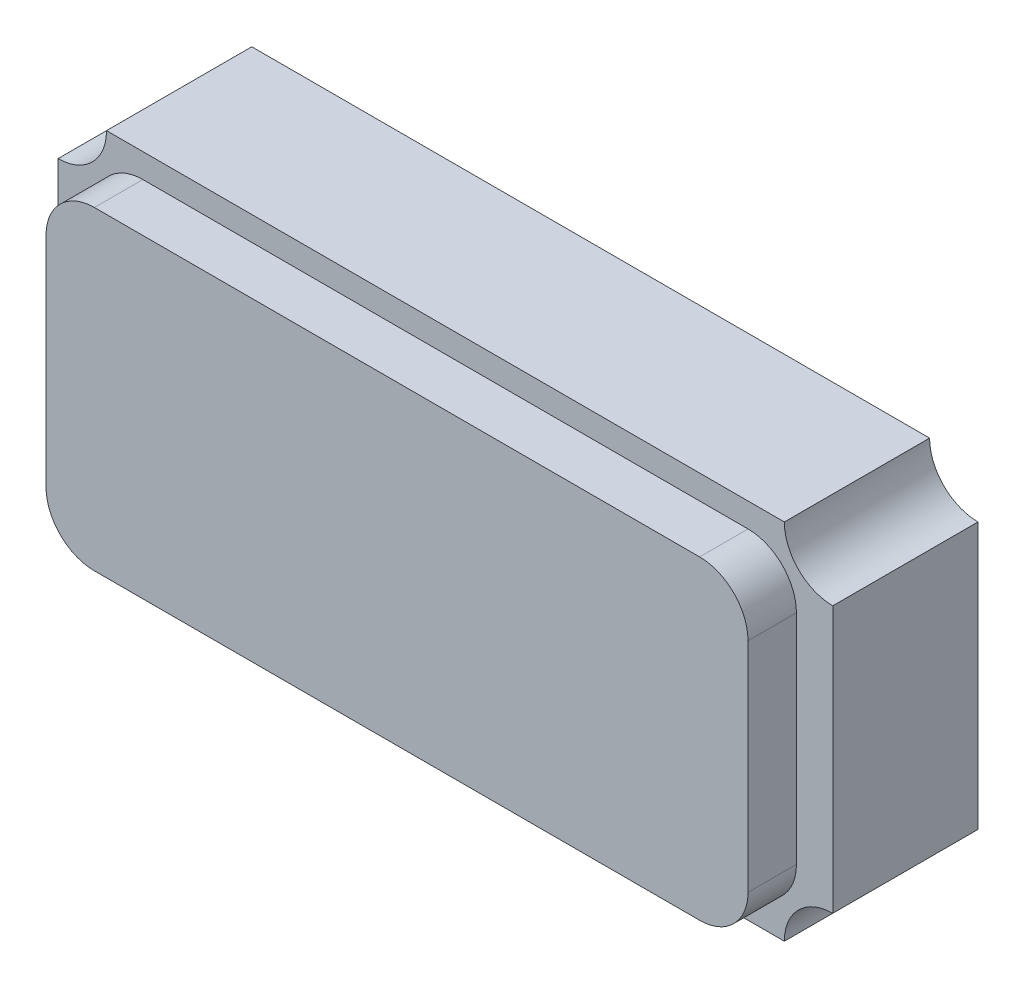
ISO-10303-21;
HEADER;
FILE_DESCRIPTION(('STEP AP214'),'2;1');
FILE_NAME('part.step','',(''),(''),'','','');
FILE_SCHEMA(('AUTOMOTIVE_DESIGN { 1 0 10303 214 1 1 1 1 }'));
ENDSEC;
DATA;
#1=APPLICATION_CONTEXT('core data for automotive mechanical design processes');
#2=APPLICATION_PROTOCOL_DEFINITION('international standard','automotive_design',2000,#1);
#3=PRODUCT_CONTEXT('',#1,'mechanical');
#4=PRODUCT('Part','Part','',(#3));
#5=PRODUCT_RELATED_PRODUCT_CATEGORY('part','',(#4));
#6=PRODUCT_DEFINITION_FORMATION('','',#4);
#7=PRODUCT_DEFINITION_CONTEXT('part definition',#1,'design');
#8=PRODUCT_DEFINITION('design','',#6,#7);
#9=PRODUCT_DEFINITION_SHAPE('','',#8);
#10=(LENGTH_UNIT() NAMED_UNIT(*) SI_UNIT(.MILLI.,.METRE.));
#11=(NAMED_UNIT(*) PLANE_ANGLE_UNIT() SI_UNIT($,.RADIAN.));
#12=(NAMED_UNIT(*) SI_UNIT($,.STERADIAN.) SOLID_ANGLE_UNIT());
#13=UNCERTAINTY_MEASURE_WITH_UNIT(LENGTH_MEASURE(1.E-05),#10,'distance_accuracy_value','');
#14=(GEOMETRIC_REPRESENTATION_CONTEXT(3) GLOBAL_UNCERTAINTY_ASSIGNED_CONTEXT((#13)) GLOBAL_UNIT_ASSIGNED_CONTEXT((#10,
#11,#12)) REPRESENTATION_CONTEXT('',''));
#15=CARTESIAN_POINT('',(0.,0.,0.));
#16=DIRECTION('',(0.,0.,1.));
#17=DIRECTION('',(1.,0.,0.));
#18=AXIS2_PLACEMENT_3D('',#15,#16,#17);
#19=CARTESIAN_POINT('',(-1.6,0.75,0.6));
#20=DIRECTION('',(0.,0.,1.));
#21=DIRECTION('',(1.,0.,0.));
#22=AXIS2_PLACEMENT_3D('',#19,#20,#21);
#23=PLANE('',#22);
#24=CARTESIAN_POINT('',(-1.6,0.75,0.6));
#25=DIRECTION('',(0.,0.,-1.));
#26=DIRECTION('',(1.,0.,0.));
#27=AXIS2_PLACEMENT_3D('',#24,#25,#26);
#28=CIRCLE('',#27,0.2);
#29=CARTESIAN_POINT('',(-1.4,0.75,0.6));
#30=VERTEX_POINT('',#29);
#31=CARTESIAN_POINT('',(-1.6,0.55,0.6));
#32=VERTEX_POINT('',#31);
#33=EDGE_CURVE('E160',#30,#32,#28,.T.);
#34=ORIENTED_EDGE('',*,*,#33,.T.);
#35=DIRECTION('',(0.,-1.,0.));
#36=VECTOR('',#35,1.);
#37=CARTESIAN_POINT('',(-1.6,-0.55,0.6));
#38=LINE('',#37,#36);
#39=CARTESIAN_POINT('',(-1.6,-0.55,0.6));
#40=VERTEX_POINT('',#39);
#41=EDGE_CURVE('E100',#32,#40,#38,.T.);
#42=ORIENTED_EDGE('',*,*,#41,.T.);
#43=CARTESIAN_POINT('',(-1.6,-0.75,0.6));
#44=DIRECTION('',(0.,0.,-1.));
#45=DIRECTION('',(-1.,0.,0.));
#46=AXIS2_PLACEMENT_3D('',#43,#44,#45);
#47=CIRCLE('',#46,0.2);
#48=CARTESIAN_POINT('',(-1.4,-0.75,0.6));
#49=VERTEX_POINT('',#48);
#50=EDGE_CURVE('E175',#40,#49,#47,.T.);
#51=ORIENTED_EDGE('',*,*,#50,.T.);
#52=DIRECTION('',(1.,0.,0.));
#53=VECTOR('',#52,1.);
#54=CARTESIAN_POINT('',(1.4,-0.75,0.6));
#55=LINE('',#54,#53);
#56=CARTESIAN_POINT('',(1.4,-0.75,0.6));
#57=VERTEX_POINT('',#56);
#58=EDGE_CURVE('E187',#49,#57,#55,.T.);
#59=ORIENTED_EDGE('',*,*,#58,.T.);
#60=CARTESIAN_POINT('',(1.6,-0.75,0.6));
#61=DIRECTION('',(0.,0.,-1.));
#62=DIRECTION('',(1.,0.,0.));
#63=AXIS2_PLACEMENT_3D('',#60,#61,#62);
#64=CIRCLE('',#63,0.2);
#65=CARTESIAN_POINT('',(1.6,-0.55,0.6));
#66=VERTEX_POINT('',#65);
#67=EDGE_CURVE('E123',#57,#66,#64,.T.);
#68=ORIENTED_EDGE('',*,*,#67,.T.);
#69=DIRECTION('',(0.,1.,0.));
#70=VECTOR('',#69,1.);
#71=CARTESIAN_POINT('',(1.6,-0.55,0.6));
#72=LINE('',#71,#70);
#73=CARTESIAN_POINT('',(1.6,0.55,0.6));
#74=VERTEX_POINT('',#73);
#75=EDGE_CURVE('E116',#66,#74,#72,.T.);
#76=ORIENTED_EDGE('',*,*,#75,.T.);
#77=CARTESIAN_POINT('',(1.6,0.75,0.6));
#78=DIRECTION('',(0.,0.,-1.));
#79=DIRECTION('',(-1.,0.,0.));
#80=AXIS2_PLACEMENT_3D('',#77,#78,#79);
#81=CIRCLE('',#80,0.2);
#82=CARTESIAN_POINT('',(1.4,0.75,0.6));
#83=VERTEX_POINT('',#82);
#84=EDGE_CURVE('E120',#74,#83,#81,.T.);
#85=ORIENTED_EDGE('',*,*,#84,.T.);
#86=DIRECTION('',(-1.,0.,0.));
#87=VECTOR('',#86,1.);
#88=CARTESIAN_POINT('',(1.4,0.75,0.6));
#89=LINE('',#88,#87);
#90=EDGE_CURVE('E59',#83,#30,#89,.T.);
#91=ORIENTED_EDGE('',*,*,#90,.T.);
#92=EDGE_LOOP('',(#34,#42,#51,#59,#68,#76,#85,#91));
#93=FACE_BOUND('',#92,.T.);
#94=DIRECTION('',(-1.,0.,0.));
#95=VECTOR('',#94,1.);
#96=CARTESIAN_POINT('',(-1.25,0.65,0.6));
#97=LINE('',#96,#95);
#98=CARTESIAN_POINT('',(1.25,0.65,0.6));
#99=VERTEX_POINT('',#98);
#100=CARTESIAN_POINT('',(-1.25,0.65,0.6));
#101=VERTEX_POINT('',#100);
#102=EDGE_CURVE('E232',#99,#101,#97,.T.);
#103=ORIENTED_EDGE('',*,*,#102,.F.);
#104=CARTESIAN_POINT('',(1.25,0.45,0.6));
#105=DIRECTION('',(0.,0.,1.));
#106=DIRECTION('',(-1.,0.,0.));
#107=AXIS2_PLACEMENT_3D('',#104,#105,#106);
#108=CIRCLE('',#107,0.2);
#109=CARTESIAN_POINT('',(1.45,0.45,0.6));
#110=VERTEX_POINT('',#109);
#111=EDGE_CURVE('E235',#110,#99,#108,.T.);
#112=ORIENTED_EDGE('',*,*,#111,.F.);
#113=DIRECTION('',(0.,1.,0.));
#114=VECTOR('',#113,1.);
#115=CARTESIAN_POINT('',(1.45,0.45,0.6));
#116=LINE('',#115,#114);
#117=CARTESIAN_POINT('',(1.45,-0.45,0.6));
#118=VERTEX_POINT('',#117);
#119=EDGE_CURVE('E215',#118,#110,#116,.T.);
#120=ORIENTED_EDGE('',*,*,#119,.F.);
#121=CARTESIAN_POINT('',(1.25,-0.45,0.6));
#122=DIRECTION('',(0.,0.,1.));
#123=DIRECTION('',(1.,0.,0.));
#124=AXIS2_PLACEMENT_3D('',#121,#122,#123);
#125=CIRCLE('',#124,0.2);
#126=CARTESIAN_POINT('',(1.25,-0.65,0.6));
#127=VERTEX_POINT('',#126);
#128=EDGE_CURVE('E218',#127,#118,#125,.T.);
#129=ORIENTED_EDGE('',*,*,#128,.F.);
#130=DIRECTION('',(1.,0.,0.));
#131=VECTOR('',#130,1.);
#132=CARTESIAN_POINT('',(-1.25,-0.65,0.6));
#133=LINE('',#132,#131);
#134=CARTESIAN_POINT('',(-1.25,-0.65,0.6));
#135=VERTEX_POINT('',#134);
#136=EDGE_CURVE('E220',#135,#127,#133,.T.);
#137=ORIENTED_EDGE('',*,*,#136,.F.);
#138=CARTESIAN_POINT('',(-1.25,-0.45,0.6));
#139=DIRECTION('',(0.,0.,1.));
#140=DIRECTION('',(-1.,0.,0.));
#141=AXIS2_PLACEMENT_3D('',#138,#139,#140);
#142=CIRCLE('',#141,0.2);
#143=CARTESIAN_POINT('',(-1.45,-0.45,0.6));
#144=VERTEX_POINT('',#143);
#145=EDGE_CURVE('E223',#144,#135,#142,.T.);
#146=ORIENTED_EDGE('',*,*,#145,.F.);
#147=DIRECTION('',(0.,-1.,0.));
#148=VECTOR('',#147,1.);
#149=CARTESIAN_POINT('',(-1.45,0.45,0.6));
#150=LINE('',#149,#148);
#151=CARTESIAN_POINT('',(-1.45,0.45,0.6));
#152=VERTEX_POINT('',#151);
#153=EDGE_CURVE('E226',#152,#144,#150,.T.);
#154=ORIENTED_EDGE('',*,*,#153,.F.);
#155=CARTESIAN_POINT('',(-1.25,0.45,0.6));
#156=DIRECTION('',(0.,0.,1.));
#157=DIRECTION('',(1.,0.,0.));
#158=AXIS2_PLACEMENT_3D('',#155,#156,#157);
#159=CIRCLE('',#158,0.2);
#160=EDGE_CURVE('E229',#101,#152,#159,.T.);
#161=ORIENTED_EDGE('',*,*,#160,.F.);
#162=EDGE_LOOP('',(#103,#112,#120,#129,#137,#146,#154,#161));
#163=FACE_BOUND('',#162,.T.);
#164=ADVANCED_FACE('F35',(#93,#163),#23,.T.);
#165=CARTESIAN_POINT('',(-1.6,0.75,0.6));
#166=DIRECTION('',(0.,0.,-1.));
#167=DIRECTION('',(-1.,0.,0.));
#168=AXIS2_PLACEMENT_3D('',#165,#166,#167);
#169=CYLINDRICAL_SURFACE('',#168,0.2);
#170=CARTESIAN_POINT('',(-1.6,0.75,0.));
#171=DIRECTION('',(0.,0.,-1.));
#172=DIRECTION('',(1.,0.,0.));
#173=AXIS2_PLACEMENT_3D('',#170,#171,#172);
#174=CIRCLE('',#173,0.2);
#175=CARTESIAN_POINT('',(-1.4,0.75,0.));
#176=VERTEX_POINT('',#175);
#177=CARTESIAN_POINT('',(-1.6,0.55,0.));
#178=VERTEX_POINT('',#177);
#179=EDGE_CURVE('E144',#176,#178,#174,.T.);
#180=ORIENTED_EDGE('',*,*,#179,.T.);
#181=DIRECTION('',(0.,0.,-1.));
#182=VECTOR('',#181,1.);
#183=CARTESIAN_POINT('',(-1.6,0.55,0.6));
#184=LINE('',#183,#182);
#185=EDGE_CURVE('E11',#32,#178,#184,.T.);
#186=ORIENTED_EDGE('',*,*,#185,.F.);
#187=ORIENTED_EDGE('',*,*,#33,.F.);
#188=DIRECTION('',(0.,0.,-1.));
#189=VECTOR('',#188,1.);
#190=CARTESIAN_POINT('',(-1.4,0.75,0.6));
#191=LINE('',#190,#189);
#192=EDGE_CURVE('E140',#30,#176,#191,.T.);
#193=ORIENTED_EDGE('',*,*,#192,.T.);
#194=EDGE_LOOP('',(#180,#186,#187,#193));
#195=FACE_BOUND('',#194,.T.);
#196=ADVANCED_FACE('F37',(#195),#169,.F.);
#197=CARTESIAN_POINT('',(-1.6,-0.55,0.6));
#198=DIRECTION('',(1.,0.,0.));
#199=DIRECTION('',(0.,1.,0.));
#200=AXIS2_PLACEMENT_3D('',#197,#198,#199);
#201=PLANE('',#200);
#202=DIRECTION('',(0.,-1.,0.));
#203=VECTOR('',#202,1.);
#204=CARTESIAN_POINT('',(-1.6,-0.55,0.));
#205=LINE('',#204,#203);
#206=CARTESIAN_POINT('',(-1.6,-0.55,0.));
#207=VERTEX_POINT('',#206);
#208=EDGE_CURVE('E147',#178,#207,#205,.T.);
#209=ORIENTED_EDGE('',*,*,#208,.T.);
#210=DIRECTION('',(0.,0.,-1.));
#211=VECTOR('',#210,1.);
#212=CARTESIAN_POINT('',(-1.6,-0.55,0.6));
#213=LINE('',#212,#211);
#214=EDGE_CURVE('E43',#40,#207,#213,.T.);
#215=ORIENTED_EDGE('',*,*,#214,.F.);
#216=ORIENTED_EDGE('',*,*,#41,.F.);
#217=ORIENTED_EDGE('',*,*,#185,.T.);
#218=EDGE_LOOP('',(#209,#215,#216,#217));
#219=FACE_BOUND('',#218,.T.);
#220=ADVANCED_FACE('F337',(#219),#201,.F.);
#221=CARTESIAN_POINT('',(-1.6,-0.75,0.6));
#222=DIRECTION('',(0.,0.,-1.));
#223=DIRECTION('',(-1.,0.,0.));
#224=AXIS2_PLACEMENT_3D('',#221,#222,#223);
#225=CYLINDRICAL_SURFACE('',#224,0.2);
#226=CARTESIAN_POINT('',(-1.6,-0.75,0.));
#227=DIRECTION('',(0.,0.,-1.));
#228=DIRECTION('',(-1.,0.,0.));
#229=AXIS2_PLACEMENT_3D('',#226,#227,#228);
#230=CIRCLE('',#229,0.2);
#231=CARTESIAN_POINT('',(-1.4,-0.75,0.));
#232=VERTEX_POINT('',#231);
#233=EDGE_CURVE('E150',#207,#232,#230,.T.);
#234=ORIENTED_EDGE('',*,*,#233,.T.);
#235=DIRECTION('',(0.,0.,-1.));
#236=VECTOR('',#235,1.);
#237=CARTESIAN_POINT('',(-1.4,-0.75,0.6));
#238=LINE('',#237,#236);
#239=EDGE_CURVE('E167',#49,#232,#238,.T.);
#240=ORIENTED_EDGE('',*,*,#239,.F.);
#241=ORIENTED_EDGE('',*,*,#50,.F.);
#242=ORIENTED_EDGE('',*,*,#214,.T.);
#243=EDGE_LOOP('',(#234,#240,#241,#242));
#244=FACE_BOUND('',#243,.T.);
#245=ADVANCED_FACE('F173',(#244),#225,.F.);
#246=CARTESIAN_POINT('',(1.4,-0.75,0.6));
#247=DIRECTION('',(0.,1.,0.));
#248=DIRECTION('',(-1.,0.,0.));
#249=AXIS2_PLACEMENT_3D('',#246,#247,#248);
#250=PLANE('',#249);
#251=DIRECTION('',(1.,0.,0.));
#252=VECTOR('',#251,1.);
#253=CARTESIAN_POINT('',(1.4,-0.75,0.));
#254=LINE('',#253,#252);
#255=CARTESIAN_POINT('',(1.4,-0.75,0.));
#256=VERTEX_POINT('',#255);
#257=EDGE_CURVE('E152',#232,#256,#254,.T.);
#258=ORIENTED_EDGE('',*,*,#257,.T.);
#259=DIRECTION('',(0.,0.,-1.));
#260=VECTOR('',#259,1.);
#261=CARTESIAN_POINT('',(1.4,-0.75,0.6));
#262=LINE('',#261,#260);
#263=EDGE_CURVE('E164',#57,#256,#262,.T.);
#264=ORIENTED_EDGE('',*,*,#263,.F.);
#265=ORIENTED_EDGE('',*,*,#58,.F.);
#266=ORIENTED_EDGE('',*,*,#239,.T.);
#267=EDGE_LOOP('',(#258,#264,#265,#266));
#268=FACE_BOUND('',#267,.T.);
#269=ADVANCED_FACE('F183',(#268),#250,.F.);
#270=CARTESIAN_POINT('',(1.6,-0.75,0.6));
#271=DIRECTION('',(0.,0.,-1.));
#272=DIRECTION('',(-1.,0.,0.));
#273=AXIS2_PLACEMENT_3D('',#270,#271,#272);
#274=CYLINDRICAL_SURFACE('',#273,0.2);
#275=CARTESIAN_POINT('',(1.6,-0.75,0.));
#276=DIRECTION('',(0.,0.,-1.));
#277=DIRECTION('',(1.,0.,0.));
#278=AXIS2_PLACEMENT_3D('',#275,#276,#277);
#279=CIRCLE('',#278,0.2);
#280=CARTESIAN_POINT('',(1.6,-0.55,0.));
#281=VERTEX_POINT('',#280);
#282=EDGE_CURVE('E154',#256,#281,#279,.T.);
#283=ORIENTED_EDGE('',*,*,#282,.T.);
#284=DIRECTION('',(0.,0.,-1.));
#285=VECTOR('',#284,1.);
#286=CARTESIAN_POINT('',(1.6,-0.55,0.6));
#287=LINE('',#286,#285);
#288=EDGE_CURVE('E135',#66,#281,#287,.T.);
#289=ORIENTED_EDGE('',*,*,#288,.F.);
#290=ORIENTED_EDGE('',*,*,#67,.F.);
#291=ORIENTED_EDGE('',*,*,#263,.T.);
#292=EDGE_LOOP('',(#283,#289,#290,#291));
#293=FACE_BOUND('',#292,.T.);
#294=ADVANCED_FACE('F186',(#293),#274,.F.);
#295=CARTESIAN_POINT('',(1.6,-0.55,0.6));
#296=DIRECTION('',(-1.,0.,0.));
#297=DIRECTION('',(0.,-1.,0.));
#298=AXIS2_PLACEMENT_3D('',#295,#296,#297);
#299=PLANE('',#298);
#300=DIRECTION('',(0.,1.,0.));
#301=VECTOR('',#300,1.);
#302=CARTESIAN_POINT('',(1.6,-0.55,0.));
#303=LINE('',#302,#301);
#304=CARTESIAN_POINT('',(1.6,0.55,0.));
#305=VERTEX_POINT('',#304);
#306=EDGE_CURVE('E132',#281,#305,#303,.T.);
#307=ORIENTED_EDGE('',*,*,#306,.T.);
#308=DIRECTION('',(0.,0.,-1.));
#309=VECTOR('',#308,1.);
#310=CARTESIAN_POINT('',(1.6,0.55,0.6));
#311=LINE('',#310,#309);
#312=EDGE_CURVE('E129',#74,#305,#311,.T.);
#313=ORIENTED_EDGE('',*,*,#312,.F.);
#314=ORIENTED_EDGE('',*,*,#75,.F.);
#315=ORIENTED_EDGE('',*,*,#288,.T.);
#316=EDGE_LOOP('',(#307,#313,#314,#315));
#317=FACE_BOUND('',#316,.T.);
#318=ADVANCED_FACE('F130',(#317),#299,.F.);
#319=CARTESIAN_POINT('',(1.6,0.75,0.6));
#320=DIRECTION('',(0.,0.,-1.));
#321=DIRECTION('',(-1.,0.,0.));
#322=AXIS2_PLACEMENT_3D('',#319,#320,#321);
#323=CYLINDRICAL_SURFACE('',#322,0.2);
#324=CARTESIAN_POINT('',(1.6,0.75,0.));
#325=DIRECTION('',(0.,0.,-1.));
#326=DIRECTION('',(-1.,0.,0.));
#327=AXIS2_PLACEMENT_3D('',#324,#325,#326);
#328=CIRCLE('',#327,0.2);
#329=CARTESIAN_POINT('',(1.4,0.75,0.));
#330=VERTEX_POINT('',#329);
#331=EDGE_CURVE('E157',#305,#330,#328,.T.);
#332=ORIENTED_EDGE('',*,*,#331,.T.);
#333=DIRECTION('',(0.,0.,-1.));
#334=VECTOR('',#333,1.);
#335=CARTESIAN_POINT('',(1.4,0.75,0.6));
#336=LINE('',#335,#334);
#337=EDGE_CURVE('E136',#83,#330,#336,.T.);
#338=ORIENTED_EDGE('',*,*,#337,.F.);
#339=ORIENTED_EDGE('',*,*,#84,.F.);
#340=ORIENTED_EDGE('',*,*,#312,.T.);
#341=EDGE_LOOP('',(#332,#338,#339,#340));
#342=FACE_BOUND('',#341,.T.);
#343=ADVANCED_FACE('F138',(#342),#323,.F.);
#344=CARTESIAN_POINT('',(1.4,0.75,0.6));
#345=DIRECTION('',(0.,-1.,0.));
#346=DIRECTION('',(1.,0.,0.));
#347=AXIS2_PLACEMENT_3D('',#344,#345,#346);
#348=PLANE('',#347);
#349=DIRECTION('',(-1.,0.,0.));
#350=VECTOR('',#349,1.);
#351=CARTESIAN_POINT('',(1.4,0.75,0.));
#352=LINE('',#351,#350);
#353=EDGE_CURVE('E92',#330,#176,#352,.T.);
#354=ORIENTED_EDGE('',*,*,#353,.T.);
#355=ORIENTED_EDGE('',*,*,#192,.F.);
#356=ORIENTED_EDGE('',*,*,#90,.F.);
#357=ORIENTED_EDGE('',*,*,#337,.T.);
#358=EDGE_LOOP('',(#354,#355,#356,#357));
#359=FACE_BOUND('',#358,.T.);
#360=ADVANCED_FACE('F344',(#359),#348,.F.);
#361=CARTESIAN_POINT('',(-1.6,0.75,0.));
#362=DIRECTION('',(0.,0.,1.));
#363=DIRECTION('',(1.,0.,0.));
#364=AXIS2_PLACEMENT_3D('',#361,#362,#363);
#365=PLANE('',#364);
#366=ORIENTED_EDGE('',*,*,#179,.F.);
#367=ORIENTED_EDGE('',*,*,#353,.F.);
#368=ORIENTED_EDGE('',*,*,#331,.F.);
#369=ORIENTED_EDGE('',*,*,#306,.F.);
#370=ORIENTED_EDGE('',*,*,#282,.F.);
#371=ORIENTED_EDGE('',*,*,#257,.F.);
#372=ORIENTED_EDGE('',*,*,#233,.F.);
#373=ORIENTED_EDGE('',*,*,#208,.F.);
#374=EDGE_LOOP('',(#366,#367,#368,#369,#370,#371,#372,#373));
#375=FACE_BOUND('',#374,.T.);
#376=ADVANCED_FACE('F179',(#375),#365,.F.);
#377=CARTESIAN_POINT('',(1.25,0.45,0.8));
#378=DIRECTION('',(0.,0.,-1.));
#379=DIRECTION('',(-1.,0.,0.));
#380=AXIS2_PLACEMENT_3D('',#377,#378,#379);
#381=CYLINDRICAL_SURFACE('',#380,0.2);
#382=ORIENTED_EDGE('',*,*,#111,.T.);
#383=DIRECTION('',(0.,0.,-1.));
#384=VECTOR('',#383,1.);
#385=CARTESIAN_POINT('',(1.25,0.65,0.8));
#386=LINE('',#385,#384);
#387=CARTESIAN_POINT('',(1.25,0.65,0.8));
#388=VERTEX_POINT('',#387);
#389=EDGE_CURVE('E148',#388,#99,#386,.T.);
#390=ORIENTED_EDGE('',*,*,#389,.F.);
#391=CARTESIAN_POINT('',(1.25,0.45,0.8));
#392=DIRECTION('',(0.,0.,1.));
#393=DIRECTION('',(-1.,0.,0.));
#394=AXIS2_PLACEMENT_3D('',#391,#392,#393);
#395=CIRCLE('',#394,0.2);
#396=CARTESIAN_POINT('',(1.45,0.45,0.8));
#397=VERTEX_POINT('',#396);
#398=EDGE_CURVE('E217',#397,#388,#395,.T.);
#399=ORIENTED_EDGE('',*,*,#398,.F.);
#400=DIRECTION('',(0.,0.,-1.));
#401=VECTOR('',#400,1.);
#402=CARTESIAN_POINT('',(1.45,0.45,0.8));
#403=LINE('',#402,#401);
#404=EDGE_CURVE('E211',#397,#110,#403,.T.);
#405=ORIENTED_EDGE('',*,*,#404,.T.);
#406=EDGE_LOOP('',(#382,#390,#399,#405));
#407=FACE_BOUND('',#406,.T.);
#408=ADVANCED_FACE('F270',(#407),#381,.T.);
#409=CARTESIAN_POINT('',(-1.25,0.65,0.8));
#410=DIRECTION('',(0.,-1.,0.));
#411=DIRECTION('',(1.,0.,0.));
#412=AXIS2_PLACEMENT_3D('',#409,#410,#411);
#413=PLANE('',#412);
#414=ORIENTED_EDGE('',*,*,#102,.T.);
#415=DIRECTION('',(0.,0.,-1.));
#416=VECTOR('',#415,1.);
#417=CARTESIAN_POINT('',(-1.25,0.65,0.8));
#418=LINE('',#417,#416);
#419=CARTESIAN_POINT('',(-1.25,0.65,0.8));
#420=VERTEX_POINT('',#419);
#421=EDGE_CURVE('E195',#420,#101,#418,.T.);
#422=ORIENTED_EDGE('',*,*,#421,.F.);
#423=DIRECTION('',(-1.,0.,0.));
#424=VECTOR('',#423,1.);
#425=CARTESIAN_POINT('',(-1.25,0.65,0.8));
#426=LINE('',#425,#424);
#427=EDGE_CURVE('E255',#388,#420,#426,.T.);
#428=ORIENTED_EDGE('',*,*,#427,.F.);
#429=ORIENTED_EDGE('',*,*,#389,.T.);
#430=EDGE_LOOP('',(#414,#422,#428,#429));
#431=FACE_BOUND('',#430,.T.);
#432=ADVANCED_FACE('F275',(#431),#413,.F.);
#433=CARTESIAN_POINT('',(-1.25,0.45,0.8));
#434=DIRECTION('',(0.,0.,-1.));
#435=DIRECTION('',(-1.,0.,0.));
#436=AXIS2_PLACEMENT_3D('',#433,#434,#435);
#437=CYLINDRICAL_SURFACE('',#436,0.2);
#438=ORIENTED_EDGE('',*,*,#160,.T.);
#439=DIRECTION('',(0.,0.,-1.));
#440=VECTOR('',#439,1.);
#441=CARTESIAN_POINT('',(-1.45,0.45,0.8));
#442=LINE('',#441,#440);
#443=CARTESIAN_POINT('',(-1.45,0.45,0.8));
#444=VERTEX_POINT('',#443);
#445=EDGE_CURVE('E198',#444,#152,#442,.T.);
#446=ORIENTED_EDGE('',*,*,#445,.F.);
#447=CARTESIAN_POINT('',(-1.25,0.45,0.8));
#448=DIRECTION('',(0.,0.,1.));
#449=DIRECTION('',(1.,0.,0.));
#450=AXIS2_PLACEMENT_3D('',#447,#448,#449);
#451=CIRCLE('',#450,0.2);
#452=EDGE_CURVE('E252',#420,#444,#451,.T.);
#453=ORIENTED_EDGE('',*,*,#452,.F.);
#454=ORIENTED_EDGE('',*,*,#421,.T.);
#455=EDGE_LOOP('',(#438,#446,#453,#454));
#456=FACE_BOUND('',#455,.T.);
#457=ADVANCED_FACE('F299',(#456),#437,.T.);
#458=CARTESIAN_POINT('',(-1.45,0.45,0.8));
#459=DIRECTION('',(1.,0.,0.));
#460=DIRECTION('',(0.,0.,-1.));
#461=AXIS2_PLACEMENT_3D('',#458,#459,#460);
#462=PLANE('',#461);
#463=ORIENTED_EDGE('',*,*,#153,.T.);
#464=DIRECTION('',(0.,0.,-1.));
#465=VECTOR('',#464,1.);
#466=CARTESIAN_POINT('',(-1.45,-0.45,0.8));
#467=LINE('',#466,#465);
#468=CARTESIAN_POINT('',(-1.45,-0.45,0.8));
#469=VERTEX_POINT('',#468);
#470=EDGE_CURVE('E201',#469,#144,#467,.T.);
#471=ORIENTED_EDGE('',*,*,#470,.F.);
#472=DIRECTION('',(0.,-1.,0.));
#473=VECTOR('',#472,1.);
#474=CARTESIAN_POINT('',(-1.45,0.45,0.8));
#475=LINE('',#474,#473);
#476=EDGE_CURVE('E249',#444,#469,#475,.T.);
#477=ORIENTED_EDGE('',*,*,#476,.F.);
#478=ORIENTED_EDGE('',*,*,#445,.T.);
#479=EDGE_LOOP('',(#463,#471,#477,#478));
#480=FACE_BOUND('',#479,.T.);
#481=ADVANCED_FACE('F304',(#480),#462,.F.);
#482=CARTESIAN_POINT('',(-1.25,-0.45,0.8));
#483=DIRECTION('',(0.,0.,-1.));
#484=DIRECTION('',(-1.,0.,0.));
#485=AXIS2_PLACEMENT_3D('',#482,#483,#484);
#486=CYLINDRICAL_SURFACE('',#485,0.2);
#487=ORIENTED_EDGE('',*,*,#145,.T.);
#488=DIRECTION('',(0.,0.,-1.));
#489=VECTOR('',#488,1.);
#490=CARTESIAN_POINT('',(-1.25,-0.65,0.8));
#491=LINE('',#490,#489);
#492=CARTESIAN_POINT('',(-1.25,-0.65,0.8));
#493=VERTEX_POINT('',#492);
#494=EDGE_CURVE('E204',#493,#135,#491,.T.);
#495=ORIENTED_EDGE('',*,*,#494,.F.);
#496=CARTESIAN_POINT('',(-1.25,-0.45,0.8));
#497=DIRECTION('',(0.,0.,1.));
#498=DIRECTION('',(-1.,0.,0.));
#499=AXIS2_PLACEMENT_3D('',#496,#497,#498);
#500=CIRCLE('',#499,0.2);
#501=EDGE_CURVE('E246',#469,#493,#500,.T.);
#502=ORIENTED_EDGE('',*,*,#501,.F.);
#503=ORIENTED_EDGE('',*,*,#470,.T.);
#504=EDGE_LOOP('',(#487,#495,#502,#503));
#505=FACE_BOUND('',#504,.T.);
#506=ADVANCED_FACE('F322',(#505),#486,.T.);
#507=CARTESIAN_POINT('',(-1.25,-0.65,0.8));
#508=DIRECTION('',(0.,1.,0.));
#509=DIRECTION('',(-1.,0.,0.));
#510=AXIS2_PLACEMENT_3D('',#507,#508,#509);
#511=PLANE('',#510);
#512=ORIENTED_EDGE('',*,*,#136,.T.);
#513=DIRECTION('',(0.,0.,-1.));
#514=VECTOR('',#513,1.);
#515=CARTESIAN_POINT('',(1.25,-0.65,0.8));
#516=LINE('',#515,#514);
#517=CARTESIAN_POINT('',(1.25,-0.65,0.8));
#518=VERTEX_POINT('',#517);
#519=EDGE_CURVE('E207',#518,#127,#516,.T.);
#520=ORIENTED_EDGE('',*,*,#519,.F.);
#521=DIRECTION('',(1.,0.,0.));
#522=VECTOR('',#521,1.);
#523=CARTESIAN_POINT('',(-1.25,-0.65,0.8));
#524=LINE('',#523,#522);
#525=EDGE_CURVE('E243',#493,#518,#524,.T.);
#526=ORIENTED_EDGE('',*,*,#525,.F.);
#527=ORIENTED_EDGE('',*,*,#494,.T.);
#528=EDGE_LOOP('',(#512,#520,#526,#527));
#529=FACE_BOUND('',#528,.T.);
#530=ADVANCED_FACE('F323',(#529),#511,.F.);
#531=CARTESIAN_POINT('',(1.25,-0.45,0.8));
#532=DIRECTION('',(0.,0.,-1.));
#533=DIRECTION('',(-1.,0.,0.));
#534=AXIS2_PLACEMENT_3D('',#531,#532,#533);
#535=CYLINDRICAL_SURFACE('',#534,0.2);
#536=ORIENTED_EDGE('',*,*,#128,.T.);
#537=DIRECTION('',(0.,0.,-1.));
#538=VECTOR('',#537,1.);
#539=CARTESIAN_POINT('',(1.45,-0.45,0.8));
#540=LINE('',#539,#538);
#541=CARTESIAN_POINT('',(1.45,-0.45,0.8));
#542=VERTEX_POINT('',#541);
#543=EDGE_CURVE('E50',#542,#118,#540,.T.);
#544=ORIENTED_EDGE('',*,*,#543,.F.);
#545=CARTESIAN_POINT('',(1.25,-0.45,0.8));
#546=DIRECTION('',(0.,0.,1.));
#547=DIRECTION('',(1.,0.,0.));
#548=AXIS2_PLACEMENT_3D('',#545,#546,#547);
#549=CIRCLE('',#548,0.2);
#550=EDGE_CURVE('E240',#518,#542,#549,.T.);
#551=ORIENTED_EDGE('',*,*,#550,.F.);
#552=ORIENTED_EDGE('',*,*,#519,.T.);
#553=EDGE_LOOP('',(#536,#544,#551,#552));
#554=FACE_BOUND('',#553,.T.);
#555=ADVANCED_FACE('F320',(#554),#535,.T.);
#556=CARTESIAN_POINT('',(1.45,0.45,0.8));
#557=DIRECTION('',(-1.,0.,0.));
#558=DIRECTION('',(0.,0.,1.));
#559=AXIS2_PLACEMENT_3D('',#556,#557,#558);
#560=PLANE('',#559);
#561=ORIENTED_EDGE('',*,*,#119,.T.);
#562=ORIENTED_EDGE('',*,*,#404,.F.);
#563=DIRECTION('',(0.,1.,0.));
#564=VECTOR('',#563,1.);
#565=CARTESIAN_POINT('',(1.45,0.45,0.8));
#566=LINE('',#565,#564);
#567=EDGE_CURVE('E214',#542,#397,#566,.T.);
#568=ORIENTED_EDGE('',*,*,#567,.F.);
#569=ORIENTED_EDGE('',*,*,#543,.T.);
#570=EDGE_LOOP('',(#561,#562,#568,#569));
#571=FACE_BOUND('',#570,.T.);
#572=ADVANCED_FACE('F292',(#571),#560,.F.);
#573=CARTESIAN_POINT('',(1.25,0.45,0.8));
#574=DIRECTION('',(0.,0.,-1.));
#575=DIRECTION('',(-1.,0.,0.));
#576=AXIS2_PLACEMENT_3D('',#573,#574,#575);
#577=PLANE('',#576);
#578=ORIENTED_EDGE('',*,*,#398,.T.);
#579=ORIENTED_EDGE('',*,*,#427,.T.);
#580=ORIENTED_EDGE('',*,*,#452,.T.);
#581=ORIENTED_EDGE('',*,*,#476,.T.);
#582=ORIENTED_EDGE('',*,*,#501,.T.);
#583=ORIENTED_EDGE('',*,*,#525,.T.);
#584=ORIENTED_EDGE('',*,*,#550,.T.);
#585=ORIENTED_EDGE('',*,*,#567,.T.);
#586=EDGE_LOOP('',(#578,#579,#580,#581,#582,#583,#584,#585));
#587=FACE_BOUND('',#586,.T.);
#588=ADVANCED_FACE('F263',(#587),#577,.F.);
#589=CLOSED_SHELL('',(#164,#196,#220,#245,#269,#294,#318,#343,#360,#376,#408,#432,#457,#481,
#506,#530,#555,#572,#588));
#590=MANIFOLD_SOLID_BREP('B2',#589);
#591=ADVANCED_BREP_SHAPE_REPRESENTATION('',(#18,#590),#14);
#592=SHAPE_DEFINITION_REPRESENTATION(#9,#591);
ENDSEC;
END-ISO-10303-21;
